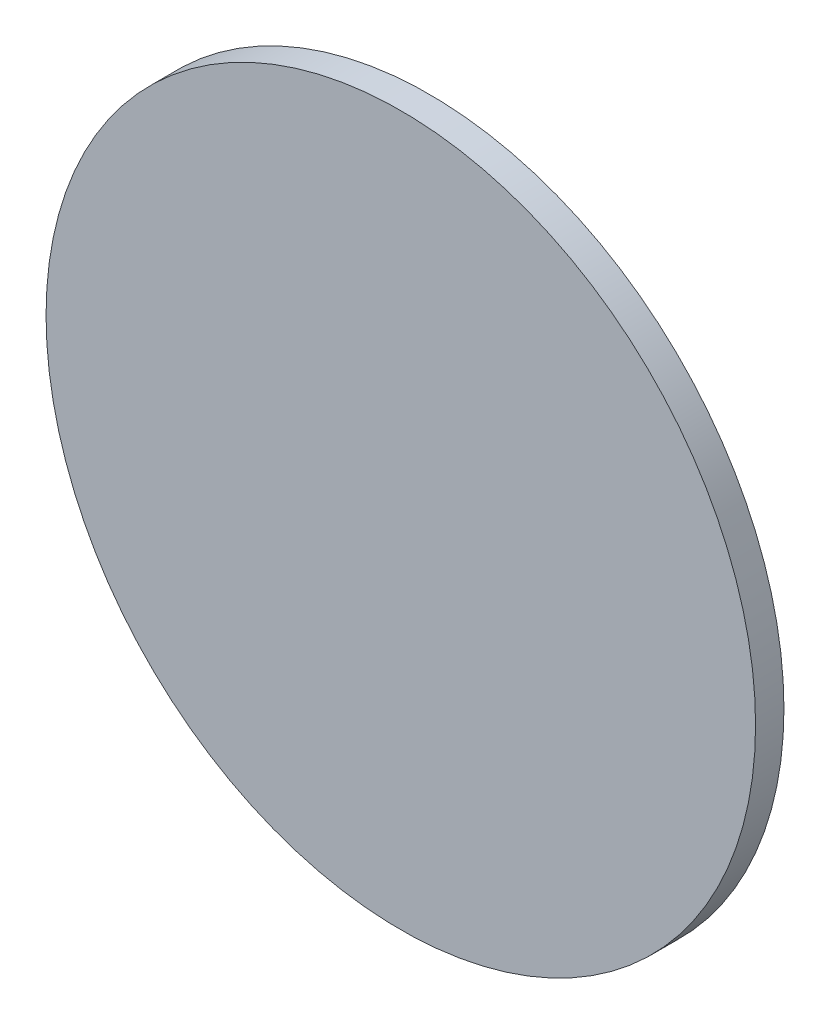
ISO-10303-21;
HEADER;
FILE_DESCRIPTION(('STEP AP214'),'2;1');
FILE_NAME('part.step','',(''),(''),'','','');
FILE_SCHEMA(('AUTOMOTIVE_DESIGN { 1 0 10303 214 1 1 1 1 }'));
ENDSEC;
DATA;
#1=APPLICATION_CONTEXT('core data for automotive mechanical design processes');
#2=APPLICATION_PROTOCOL_DEFINITION('international standard','automotive_design',2000,#1);
#3=PRODUCT_CONTEXT('',#1,'mechanical');
#4=PRODUCT('Part','Part','',(#3));
#5=PRODUCT_RELATED_PRODUCT_CATEGORY('part','',(#4));
#6=PRODUCT_DEFINITION_FORMATION('','',#4);
#7=PRODUCT_DEFINITION_CONTEXT('part definition',#1,'design');
#8=PRODUCT_DEFINITION('design','',#6,#7);
#9=PRODUCT_DEFINITION_SHAPE('','',#8);
#10=(LENGTH_UNIT() NAMED_UNIT(*) SI_UNIT(.MILLI.,.METRE.));
#11=(NAMED_UNIT(*) PLANE_ANGLE_UNIT() SI_UNIT($,.RADIAN.));
#12=(NAMED_UNIT(*) SI_UNIT($,.STERADIAN.) SOLID_ANGLE_UNIT());
#13=UNCERTAINTY_MEASURE_WITH_UNIT(LENGTH_MEASURE(1.E-05),#10,'distance_accuracy_value','');
#14=(GEOMETRIC_REPRESENTATION_CONTEXT(3) GLOBAL_UNCERTAINTY_ASSIGNED_CONTEXT((#13)) GLOBAL_UNIT_ASSIGNED_CONTEXT((#10,
#11,#12)) REPRESENTATION_CONTEXT('',''));
#15=CARTESIAN_POINT('',(0.,0.,0.));
#16=DIRECTION('',(0.,0.,1.));
#17=DIRECTION('',(1.,0.,0.));
#18=AXIS2_PLACEMENT_3D('',#15,#16,#17);
#19=CARTESIAN_POINT('',(0.,0.,0.5));
#20=DIRECTION('',(0.,0.,-1.));
#21=DIRECTION('',(-1.,0.,0.));
#22=AXIS2_PLACEMENT_3D('',#19,#20,#21);
#23=CYLINDRICAL_SURFACE('',#22,12.5);
#24=CARTESIAN_POINT('',(0.,0.,0.5));
#25=DIRECTION('',(0.,0.,1.));
#26=DIRECTION('',(1.,0.,0.));
#27=AXIS2_PLACEMENT_3D('',#24,#25,#26);
#28=CIRCLE('',#27,12.5);
#29=CARTESIAN_POINT('',(12.5,0.,0.5));
#30=VERTEX_POINT('',#29);
#31=EDGE_CURVE('E10',#30,#30,#28,.T.);
#32=ORIENTED_EDGE('',*,*,#31,.F.);
#33=EDGE_LOOP('',(#32));
#34=FACE_BOUND('',#33,.T.);
#35=CARTESIAN_POINT('',(0.,0.,-0.5));
#36=DIRECTION('',(0.,0.,1.));
#37=DIRECTION('',(1.,0.,0.));
#38=AXIS2_PLACEMENT_3D('',#35,#36,#37);
#39=CIRCLE('',#38,12.5);
#40=CARTESIAN_POINT('',(12.5,0.,-0.5));
#41=VERTEX_POINT('',#40);
#42=EDGE_CURVE('E37',#41,#41,#39,.T.);
#43=ORIENTED_EDGE('',*,*,#42,.T.);
#44=EDGE_LOOP('',(#43));
#45=FACE_BOUND('',#44,.T.);
#46=ADVANCED_FACE('F40',(#34,#45),#23,.T.);
#47=CARTESIAN_POINT('',(0.,0.,0.5));
#48=DIRECTION('',(0.,0.,1.));
#49=DIRECTION('',(1.,0.,0.));
#50=AXIS2_PLACEMENT_3D('',#47,#48,#49);
#51=PLANE('',#50);
#52=ORIENTED_EDGE('',*,*,#31,.T.);
#53=EDGE_LOOP('',(#52));
#54=FACE_BOUND('',#53,.T.);
#55=ADVANCED_FACE('F55',(#54),#51,.T.);
#56=CARTESIAN_POINT('',(0.,0.,-0.5));
#57=DIRECTION('',(0.,0.,1.));
#58=DIRECTION('',(1.,0.,0.));
#59=AXIS2_PLACEMENT_3D('',#56,#57,#58);
#60=PLANE('',#59);
#61=ORIENTED_EDGE('',*,*,#42,.F.);
#62=EDGE_LOOP('',(#61));
#63=FACE_BOUND('',#62,.T.);
#64=ADVANCED_FACE('F49',(#63),#60,.F.);
#65=CLOSED_SHELL('',(#46,#55,#64));
#66=MANIFOLD_SOLID_BREP('B2',#65);
#67=ADVANCED_BREP_SHAPE_REPRESENTATION('',(#18,#66),#14);
#68=SHAPE_DEFINITION_REPRESENTATION(#9,#67);
ENDSEC;
END-ISO-10303-21;
